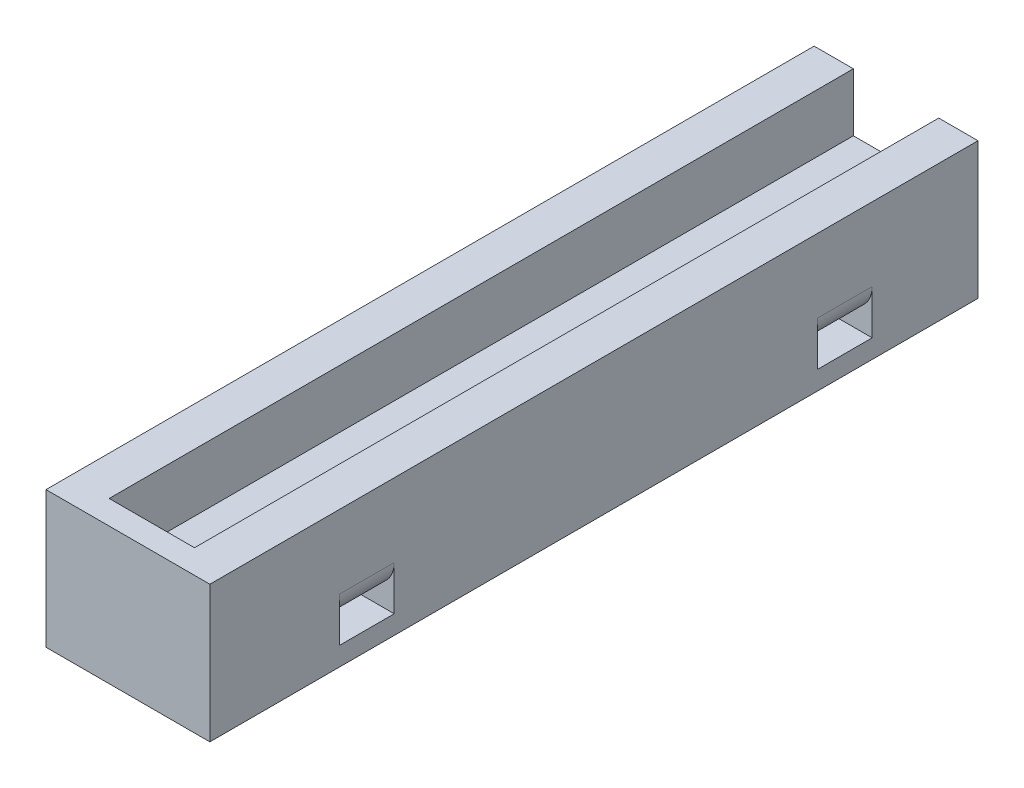
ISO-10303-21;
HEADER;
FILE_DESCRIPTION(('STEP AP214'),'2;1');
FILE_NAME('part.step','',(''),(''),'','','');
FILE_SCHEMA(('AUTOMOTIVE_DESIGN { 1 0 10303 214 1 1 1 1 }'));
ENDSEC;
DATA;
#1=APPLICATION_CONTEXT('core data for automotive mechanical design processes');
#2=APPLICATION_PROTOCOL_DEFINITION('international standard','automotive_design',2000,#1);
#3=PRODUCT_CONTEXT('',#1,'mechanical');
#4=PRODUCT('Part','Part','',(#3));
#5=PRODUCT_RELATED_PRODUCT_CATEGORY('part','',(#4));
#6=PRODUCT_DEFINITION_FORMATION('','',#4);
#7=PRODUCT_DEFINITION_CONTEXT('part definition',#1,'design');
#8=PRODUCT_DEFINITION('design','',#6,#7);
#9=PRODUCT_DEFINITION_SHAPE('','',#8);
#10=(LENGTH_UNIT() NAMED_UNIT(*) SI_UNIT(.MILLI.,.METRE.));
#11=(NAMED_UNIT(*) PLANE_ANGLE_UNIT() SI_UNIT($,.RADIAN.));
#12=(NAMED_UNIT(*) SI_UNIT($,.STERADIAN.) SOLID_ANGLE_UNIT());
#13=UNCERTAINTY_MEASURE_WITH_UNIT(LENGTH_MEASURE(1.E-05),#10,'distance_accuracy_value','');
#14=(GEOMETRIC_REPRESENTATION_CONTEXT(3) GLOBAL_UNCERTAINTY_ASSIGNED_CONTEXT((#13)) GLOBAL_UNIT_ASSIGNED_CONTEXT((#10,
#11,#12)) REPRESENTATION_CONTEXT('',''));
#15=CARTESIAN_POINT('',(0.,0.,0.));
#16=DIRECTION('',(0.,0.,1.));
#17=DIRECTION('',(1.,0.,0.));
#18=AXIS2_PLACEMENT_3D('',#15,#16,#17);
#19=CARTESIAN_POINT('',(-43.,0.,109.));
#20=DIRECTION('',(-1.,0.,0.));
#21=DIRECTION('',(0.,0.,1.));
#22=AXIS2_PLACEMENT_3D('',#19,#20,#21);
#23=PLANE('',#22);
#24=DIRECTION('',(0.,0.,1.));
#25=VECTOR('',#24,1.);
#26=CARTESIAN_POINT('',(-43.,9.25,93.5));
#27=LINE('',#26,#25);
#28=CARTESIAN_POINT('',(-43.,9.25,85.5));
#29=VERTEX_POINT('',#28);
#30=CARTESIAN_POINT('',(-43.,9.25,93.5));
#31=VERTEX_POINT('',#30);
#32=EDGE_CURVE('E206',#29,#31,#27,.T.);
#33=ORIENTED_EDGE('',*,*,#32,.T.);
#34=DIRECTION('',(0.,-1.,0.));
#35=VECTOR('',#34,1.);
#36=CARTESIAN_POINT('',(-43.,2.75,93.5));
#37=LINE('',#36,#35);
#38=CARTESIAN_POINT('',(-43.,2.75,93.5));
#39=VERTEX_POINT('',#38);
#40=EDGE_CURVE('E186',#31,#39,#37,.T.);
#41=ORIENTED_EDGE('',*,*,#40,.T.);
#42=DIRECTION('',(0.,0.,-1.));
#43=VECTOR('',#42,1.);
#44=CARTESIAN_POINT('',(-43.,2.75,93.5));
#45=LINE('',#44,#43);
#46=CARTESIAN_POINT('',(-43.,2.75,85.5));
#47=VERTEX_POINT('',#46);
#48=EDGE_CURVE('E197',#39,#47,#45,.T.);
#49=ORIENTED_EDGE('',*,*,#48,.T.);
#50=DIRECTION('',(0.,1.,0.));
#51=VECTOR('',#50,1.);
#52=CARTESIAN_POINT('',(-43.,2.75,85.5));
#53=LINE('',#52,#51);
#54=EDGE_CURVE('E207',#47,#29,#53,.T.);
#55=ORIENTED_EDGE('',*,*,#54,.T.);
#56=EDGE_LOOP('',(#33,#41,#49,#55));
#57=FACE_BOUND('',#56,.T.);
#58=DIRECTION('',(0.,0.,1.));
#59=VECTOR('',#58,1.);
#60=CARTESIAN_POINT('',(-43.,9.25,23.5));
#61=LINE('',#60,#59);
#62=CARTESIAN_POINT('',(-43.,9.25,15.5));
#63=VERTEX_POINT('',#62);
#64=CARTESIAN_POINT('',(-43.,9.25,23.5));
#65=VERTEX_POINT('',#64);
#66=EDGE_CURVE('E322',#63,#65,#61,.T.);
#67=ORIENTED_EDGE('',*,*,#66,.T.);
#68=DIRECTION('',(0.,-1.,0.));
#69=VECTOR('',#68,1.);
#70=CARTESIAN_POINT('',(-43.,2.75,23.5));
#71=LINE('',#70,#69);
#72=CARTESIAN_POINT('',(-43.,2.75,23.5));
#73=VERTEX_POINT('',#72);
#74=EDGE_CURVE('E236',#65,#73,#71,.T.);
#75=ORIENTED_EDGE('',*,*,#74,.T.);
#76=DIRECTION('',(0.,0.,-1.));
#77=VECTOR('',#76,1.);
#78=CARTESIAN_POINT('',(-43.,2.75,15.5));
#79=LINE('',#78,#77);
#80=CARTESIAN_POINT('',(-43.,2.75,15.5));
#81=VERTEX_POINT('',#80);
#82=EDGE_CURVE('E241',#73,#81,#79,.T.);
#83=ORIENTED_EDGE('',*,*,#82,.T.);
#84=DIRECTION('',(0.,1.,0.));
#85=VECTOR('',#84,1.);
#86=CARTESIAN_POINT('',(-43.,2.75,15.5));
#87=LINE('',#86,#85);
#88=EDGE_CURVE('E225',#81,#63,#87,.T.);
#89=ORIENTED_EDGE('',*,*,#88,.T.);
#90=EDGE_LOOP('',(#67,#75,#83,#89));
#91=FACE_BOUND('',#90,.T.);
#92=DIRECTION('',(0.,1.,0.));
#93=VECTOR('',#92,1.);
#94=CARTESIAN_POINT('',(-43.,0.,0.));
#95=LINE('',#94,#93);
#96=CARTESIAN_POINT('',(-43.,0.,0.));
#97=VERTEX_POINT('',#96);
#98=CARTESIAN_POINT('',(-43.,20.,0.));
#99=VERTEX_POINT('',#98);
#100=EDGE_CURVE('E270',#97,#99,#95,.T.);
#101=ORIENTED_EDGE('',*,*,#100,.F.);
#102=DIRECTION('',(0.,0.,-1.));
#103=VECTOR('',#102,1.);
#104=CARTESIAN_POINT('',(-43.,0.,109.));
#105=LINE('',#104,#103);
#106=CARTESIAN_POINT('',(-43.,0.,112.5));
#107=VERTEX_POINT('',#106);
#108=EDGE_CURVE('E319',#107,#97,#105,.T.);
#109=ORIENTED_EDGE('',*,*,#108,.F.);
#110=DIRECTION('',(0.,-1.,0.));
#111=VECTOR('',#110,1.);
#112=CARTESIAN_POINT('',(-43.,20.,112.5));
#113=LINE('',#112,#111);
#114=CARTESIAN_POINT('',(-43.,20.,112.5));
#115=VERTEX_POINT('',#114);
#116=EDGE_CURVE('E258',#115,#107,#113,.T.);
#117=ORIENTED_EDGE('',*,*,#116,.F.);
#118=DIRECTION('',(0.,0.,-1.));
#119=VECTOR('',#118,1.);
#120=CARTESIAN_POINT('',(-43.,20.,109.));
#121=LINE('',#120,#119);
#122=EDGE_CURVE('E283',#115,#99,#121,.T.);
#123=ORIENTED_EDGE('',*,*,#122,.T.);
#124=EDGE_LOOP('',(#101,#109,#117,#123));
#125=FACE_BOUND('',#124,.T.);
#126=ADVANCED_FACE('F41',(#57,#91,#125),#23,.T.);
#127=CARTESIAN_POINT('',(0.,0.,109.));
#128=DIRECTION('',(0.,-1.,0.));
#129=DIRECTION('',(1.,0.,0.));
#130=AXIS2_PLACEMENT_3D('',#127,#128,#129);
#131=PLANE('',#130);
#132=DIRECTION('',(-1.,0.,0.));
#133=VECTOR('',#132,1.);
#134=CARTESIAN_POINT('',(0.,0.,0.));
#135=LINE('',#134,#133);
#136=CARTESIAN_POINT('',(-19.,0.,0.));
#137=VERTEX_POINT('',#136);
#138=EDGE_CURVE('E286',#137,#97,#135,.T.);
#139=ORIENTED_EDGE('',*,*,#138,.F.);
#140=DIRECTION('',(0.,0.,-1.));
#141=VECTOR('',#140,1.);
#142=CARTESIAN_POINT('',(-19.,0.,109.));
#143=LINE('',#142,#141);
#144=CARTESIAN_POINT('',(-19.,0.,112.5));
#145=VERTEX_POINT('',#144);
#146=EDGE_CURVE('E317',#145,#137,#143,.T.);
#147=ORIENTED_EDGE('',*,*,#146,.F.);
#148=DIRECTION('',(1.,0.,0.));
#149=VECTOR('',#148,1.);
#150=CARTESIAN_POINT('',(-43.,0.,112.5));
#151=LINE('',#150,#149);
#152=EDGE_CURVE('E261',#107,#145,#151,.T.);
#153=ORIENTED_EDGE('',*,*,#152,.F.);
#154=ORIENTED_EDGE('',*,*,#108,.T.);
#155=EDGE_LOOP('',(#139,#147,#153,#154));
#156=FACE_BOUND('',#155,.T.);
#157=ADVANCED_FACE('F382',(#156),#131,.T.);
#158=CARTESIAN_POINT('',(-19.,0.,109.));
#159=DIRECTION('',(-1.,0.,0.));
#160=DIRECTION('',(0.,0.,1.));
#161=AXIS2_PLACEMENT_3D('',#158,#159,#160);
#162=PLANE('',#161);
#163=DIRECTION('',(0.,-1.,0.));
#164=VECTOR('',#163,1.);
#165=CARTESIAN_POINT('',(-19.,2.75,93.5));
#166=LINE('',#165,#164);
#167=CARTESIAN_POINT('',(-19.,9.25,93.5));
#168=VERTEX_POINT('',#167);
#169=CARTESIAN_POINT('',(-19.,2.75,93.5));
#170=VERTEX_POINT('',#169);
#171=EDGE_CURVE('E189',#168,#170,#166,.T.);
#172=ORIENTED_EDGE('',*,*,#171,.F.);
#173=DIRECTION('',(0.,0.,1.));
#174=VECTOR('',#173,1.);
#175=CARTESIAN_POINT('',(-19.,9.25,109.));
#176=LINE('',#175,#174);
#177=CARTESIAN_POINT('',(-19.,9.25,85.5));
#178=VERTEX_POINT('',#177);
#179=EDGE_CURVE('E335',#168,#178,#176,.F.);
#180=ORIENTED_EDGE('',*,*,#179,.T.);
#181=DIRECTION('',(0.,1.,0.));
#182=VECTOR('',#181,1.);
#183=CARTESIAN_POINT('',(-19.,2.75,85.5));
#184=LINE('',#183,#182);
#185=CARTESIAN_POINT('',(-19.,2.75,85.5));
#186=VERTEX_POINT('',#185);
#187=EDGE_CURVE('E212',#186,#178,#184,.T.);
#188=ORIENTED_EDGE('',*,*,#187,.F.);
#189=DIRECTION('',(0.,0.,-1.));
#190=VECTOR('',#189,1.);
#191=CARTESIAN_POINT('',(-19.,2.75,93.5));
#192=LINE('',#191,#190);
#193=EDGE_CURVE('E209',#170,#186,#192,.T.);
#194=ORIENTED_EDGE('',*,*,#193,.F.);
#195=EDGE_LOOP('',(#172,#180,#188,#194));
#196=FACE_BOUND('',#195,.T.);
#197=DIRECTION('',(0.,-1.,0.));
#198=VECTOR('',#197,1.);
#199=CARTESIAN_POINT('',(-19.,2.75,23.5));
#200=LINE('',#199,#198);
#201=CARTESIAN_POINT('',(-19.,9.25,23.5));
#202=VERTEX_POINT('',#201);
#203=CARTESIAN_POINT('',(-19.,2.75,23.5));
#204=VERTEX_POINT('',#203);
#205=EDGE_CURVE('E56',#202,#204,#200,.T.);
#206=ORIENTED_EDGE('',*,*,#205,.F.);
#207=DIRECTION('',(0.,0.,1.));
#208=VECTOR('',#207,1.);
#209=CARTESIAN_POINT('',(-19.,9.24999999999999,109.));
#210=LINE('',#209,#208);
#211=CARTESIAN_POINT('',(-19.,9.25,15.5));
#212=VERTEX_POINT('',#211);
#213=EDGE_CURVE('E338',#202,#212,#210,.F.);
#214=ORIENTED_EDGE('',*,*,#213,.T.);
#215=DIRECTION('',(0.,1.,0.));
#216=VECTOR('',#215,1.);
#217=CARTESIAN_POINT('',(-19.,2.75,15.5));
#218=LINE('',#217,#216);
#219=CARTESIAN_POINT('',(-19.,2.75,15.5));
#220=VERTEX_POINT('',#219);
#221=EDGE_CURVE('E64',#220,#212,#218,.T.);
#222=ORIENTED_EDGE('',*,*,#221,.F.);
#223=DIRECTION('',(0.,0.,-1.));
#224=VECTOR('',#223,1.);
#225=CARTESIAN_POINT('',(-19.,2.75,15.5));
#226=LINE('',#225,#224);
#227=EDGE_CURVE('E235',#204,#220,#226,.T.);
#228=ORIENTED_EDGE('',*,*,#227,.F.);
#229=EDGE_LOOP('',(#206,#214,#222,#228));
#230=FACE_BOUND('',#229,.T.);
#231=DIRECTION('',(0.,1.,0.));
#232=VECTOR('',#231,1.);
#233=CARTESIAN_POINT('',(-19.,0.,0.));
#234=LINE('',#233,#232);
#235=CARTESIAN_POINT('',(-19.,20.,0.));
#236=VERTEX_POINT('',#235);
#237=EDGE_CURVE('E289',#137,#236,#234,.T.);
#238=ORIENTED_EDGE('',*,*,#237,.T.);
#239=DIRECTION('',(0.,0.,-1.));
#240=VECTOR('',#239,1.);
#241=CARTESIAN_POINT('',(-19.,20.,109.));
#242=LINE('',#241,#240);
#243=CARTESIAN_POINT('',(-19.,20.,112.5));
#244=VERTEX_POINT('',#243);
#245=EDGE_CURVE('E315',#244,#236,#242,.T.);
#246=ORIENTED_EDGE('',*,*,#245,.F.);
#247=DIRECTION('',(0.,1.,0.));
#248=VECTOR('',#247,1.);
#249=CARTESIAN_POINT('',(-19.,20.,112.5));
#250=LINE('',#249,#248);
#251=EDGE_CURVE('E264',#145,#244,#250,.T.);
#252=ORIENTED_EDGE('',*,*,#251,.F.);
#253=ORIENTED_EDGE('',*,*,#146,.T.);
#254=EDGE_LOOP('',(#238,#246,#252,#253));
#255=FACE_BOUND('',#254,.T.);
#256=ADVANCED_FACE('F360',(#196,#230,#255),#162,.F.);
#257=CARTESIAN_POINT('',(-24.75,0.,109.));
#258=DIRECTION('',(-1.,0.,0.));
#259=DIRECTION('',(0.,0.,1.));
#260=AXIS2_PLACEMENT_3D('',#257,#258,#259);
#261=PLANE('',#260);
#262=DIRECTION('',(0.,1.,0.));
#263=VECTOR('',#262,1.);
#264=CARTESIAN_POINT('',(-24.75,0.,0.));
#265=LINE('',#264,#263);
#266=CARTESIAN_POINT('',(-24.75,11.5,0.));
#267=VERTEX_POINT('',#266);
#268=CARTESIAN_POINT('',(-24.75,20.,0.));
#269=VERTEX_POINT('',#268);
#270=EDGE_CURVE('E295',#267,#269,#265,.T.);
#271=ORIENTED_EDGE('',*,*,#270,.F.);
#272=DIRECTION('',(0.,0.,-1.));
#273=VECTOR('',#272,1.);
#274=CARTESIAN_POINT('',(-24.75,11.5,109.));
#275=LINE('',#274,#273);
#276=CARTESIAN_POINT('',(-24.75,11.5,109.));
#277=VERTEX_POINT('',#276);
#278=EDGE_CURVE('E311',#277,#267,#275,.T.);
#279=ORIENTED_EDGE('',*,*,#278,.F.);
#280=DIRECTION('',(0.,1.,0.));
#281=VECTOR('',#280,1.);
#282=CARTESIAN_POINT('',(-24.75,0.,109.));
#283=LINE('',#282,#281);
#284=CARTESIAN_POINT('',(-24.75,20.,109.));
#285=VERTEX_POINT('',#284);
#286=EDGE_CURVE('E273',#277,#285,#283,.T.);
#287=ORIENTED_EDGE('',*,*,#286,.T.);
#288=DIRECTION('',(0.,0.,-1.));
#289=VECTOR('',#288,1.);
#290=CARTESIAN_POINT('',(-24.75,20.,109.));
#291=LINE('',#290,#289);
#292=EDGE_CURVE('E313',#285,#269,#291,.T.);
#293=ORIENTED_EDGE('',*,*,#292,.T.);
#294=EDGE_LOOP('',(#271,#279,#287,#293));
#295=FACE_BOUND('',#294,.T.);
#296=ADVANCED_FACE('F420',(#295),#261,.T.);
#297=CARTESIAN_POINT('',(0.,11.5,109.));
#298=DIRECTION('',(0.,1.,0.));
#299=DIRECTION('',(0.,0.,1.));
#300=AXIS2_PLACEMENT_3D('',#297,#298,#299);
#301=PLANE('',#300);
#302=DIRECTION('',(1.,0.,0.));
#303=VECTOR('',#302,1.);
#304=CARTESIAN_POINT('',(0.,11.5,0.));
#305=LINE('',#304,#303);
#306=CARTESIAN_POINT('',(-37.25,11.5,0.));
#307=VERTEX_POINT('',#306);
#308=EDGE_CURVE('E298',#307,#267,#305,.T.);
#309=ORIENTED_EDGE('',*,*,#308,.F.);
#310=DIRECTION('',(0.,0.,-1.));
#311=VECTOR('',#310,1.);
#312=CARTESIAN_POINT('',(-37.25,11.5,109.));
#313=LINE('',#312,#311);
#314=CARTESIAN_POINT('',(-37.25,11.5,109.));
#315=VERTEX_POINT('',#314);
#316=EDGE_CURVE('E309',#315,#307,#313,.T.);
#317=ORIENTED_EDGE('',*,*,#316,.F.);
#318=DIRECTION('',(1.,0.,0.));
#319=VECTOR('',#318,1.);
#320=CARTESIAN_POINT('',(0.,11.5,109.));
#321=LINE('',#320,#319);
#322=EDGE_CURVE('E276',#315,#277,#321,.T.);
#323=ORIENTED_EDGE('',*,*,#322,.T.);
#324=ORIENTED_EDGE('',*,*,#278,.T.);
#325=EDGE_LOOP('',(#309,#317,#323,#324));
#326=FACE_BOUND('',#325,.T.);
#327=ADVANCED_FACE('F445',(#326),#301,.T.);
#328=CARTESIAN_POINT('',(-37.25,0.,109.));
#329=DIRECTION('',(1.,0.,0.));
#330=DIRECTION('',(0.,0.,-1.));
#331=AXIS2_PLACEMENT_3D('',#328,#329,#330);
#332=PLANE('',#331);
#333=DIRECTION('',(0.,-1.,0.));
#334=VECTOR('',#333,1.);
#335=CARTESIAN_POINT('',(-37.25,0.,0.));
#336=LINE('',#335,#334);
#337=CARTESIAN_POINT('',(-37.25,20.,0.));
#338=VERTEX_POINT('',#337);
#339=EDGE_CURVE('E301',#338,#307,#336,.T.);
#340=ORIENTED_EDGE('',*,*,#339,.F.);
#341=DIRECTION('',(0.,0.,-1.));
#342=VECTOR('',#341,1.);
#343=CARTESIAN_POINT('',(-37.25,20.,109.));
#344=LINE('',#343,#342);
#345=CARTESIAN_POINT('',(-37.25,20.,109.));
#346=VERTEX_POINT('',#345);
#347=EDGE_CURVE('E307',#346,#338,#344,.T.);
#348=ORIENTED_EDGE('',*,*,#347,.F.);
#349=DIRECTION('',(0.,-1.,0.));
#350=VECTOR('',#349,1.);
#351=CARTESIAN_POINT('',(-37.25,0.,109.));
#352=LINE('',#351,#350);
#353=EDGE_CURVE('E280',#346,#315,#352,.T.);
#354=ORIENTED_EDGE('',*,*,#353,.T.);
#355=ORIENTED_EDGE('',*,*,#316,.T.);
#356=EDGE_LOOP('',(#340,#348,#354,#355));
#357=FACE_BOUND('',#356,.T.);
#358=ADVANCED_FACE('F441',(#357),#332,.T.);
#359=CARTESIAN_POINT('',(0.,20.,109.));
#360=DIRECTION('',(0.,-1.,0.));
#361=DIRECTION('',(1.,0.,0.));
#362=AXIS2_PLACEMENT_3D('',#359,#360,#361);
#363=PLANE('',#362);
#364=DIRECTION('',(-1.,0.,0.));
#365=VECTOR('',#364,1.);
#366=CARTESIAN_POINT('',(0.,20.,0.));
#367=LINE('',#366,#365);
#368=EDGE_CURVE('E277',#338,#99,#367,.T.);
#369=ORIENTED_EDGE('',*,*,#368,.T.);
#370=ORIENTED_EDGE('',*,*,#122,.F.);
#371=DIRECTION('',(-1.,0.,0.));
#372=VECTOR('',#371,1.);
#373=CARTESIAN_POINT('',(-43.,20.,112.5));
#374=LINE('',#373,#372);
#375=EDGE_CURVE('E267',#244,#115,#374,.T.);
#376=ORIENTED_EDGE('',*,*,#375,.F.);
#377=ORIENTED_EDGE('',*,*,#245,.T.);
#378=DIRECTION('',(1.,0.,0.));
#379=VECTOR('',#378,1.);
#380=CARTESIAN_POINT('',(0.,20.,0.));
#381=LINE('',#380,#379);
#382=EDGE_CURVE('E292',#269,#236,#381,.T.);
#383=ORIENTED_EDGE('',*,*,#382,.F.);
#384=ORIENTED_EDGE('',*,*,#292,.F.);
#385=DIRECTION('',(-1.,0.,0.));
#386=VECTOR('',#385,1.);
#387=CARTESIAN_POINT('',(-43.,20.,109.));
#388=LINE('',#387,#386);
#389=EDGE_CURVE('E257',#285,#346,#388,.T.);
#390=ORIENTED_EDGE('',*,*,#389,.T.);
#391=ORIENTED_EDGE('',*,*,#347,.T.);
#392=EDGE_LOOP('',(#369,#370,#376,#377,#383,#384,#390,#391));
#393=FACE_BOUND('',#392,.T.);
#394=ADVANCED_FACE('F430',(#393),#363,.F.);
#395=CARTESIAN_POINT('',(0.,0.,0.));
#396=DIRECTION('',(0.,0.,1.));
#397=DIRECTION('',(1.,0.,0.));
#398=AXIS2_PLACEMENT_3D('',#395,#396,#397);
#399=PLANE('',#398);
#400=CARTESIAN_POINT('',(-26.,5.6,0.));
#401=DIRECTION('',(0.,0.,-1.));
#402=DIRECTION('',(-1.,0.,0.));
#403=AXIS2_PLACEMENT_3D('',#400,#401,#402);
#404=CIRCLE('',#403,1.59999999999999);
#405=CARTESIAN_POINT('',(-27.6,5.6,0.));
#406=VERTEX_POINT('',#405);
#407=EDGE_CURVE('E216',#406,#406,#404,.T.);
#408=ORIENTED_EDGE('',*,*,#407,.F.);
#409=EDGE_LOOP('',(#408));
#410=FACE_BOUND('',#409,.T.);
#411=CARTESIAN_POINT('',(-36.,5.6,0.));
#412=DIRECTION('',(0.,0.,-1.));
#413=DIRECTION('',(-1.,0.,0.));
#414=AXIS2_PLACEMENT_3D('',#411,#412,#413);
#415=CIRCLE('',#414,1.59999999999999);
#416=CARTESIAN_POINT('',(-37.6,5.6,0.));
#417=VERTEX_POINT('',#416);
#418=EDGE_CURVE('E251',#417,#417,#415,.T.);
#419=ORIENTED_EDGE('',*,*,#418,.F.);
#420=EDGE_LOOP('',(#419));
#421=FACE_BOUND('',#420,.T.);
#422=ORIENTED_EDGE('',*,*,#100,.T.);
#423=ORIENTED_EDGE('',*,*,#368,.F.);
#424=ORIENTED_EDGE('',*,*,#339,.T.);
#425=ORIENTED_EDGE('',*,*,#308,.T.);
#426=ORIENTED_EDGE('',*,*,#270,.T.);
#427=ORIENTED_EDGE('',*,*,#382,.T.);
#428=ORIENTED_EDGE('',*,*,#237,.F.);
#429=ORIENTED_EDGE('',*,*,#138,.T.);
#430=EDGE_LOOP('',(#422,#423,#424,#425,#426,#427,#428,#429));
#431=FACE_BOUND('',#430,.T.);
#432=ADVANCED_FACE('F426',(#410,#421,#431),#399,.F.);
#433=CARTESIAN_POINT('',(0.,0.,112.5));
#434=DIRECTION('',(0.,0.,1.));
#435=DIRECTION('',(1.,0.,0.));
#436=AXIS2_PLACEMENT_3D('',#433,#434,#435);
#437=PLANE('',#436);
#438=ORIENTED_EDGE('',*,*,#116,.T.);
#439=ORIENTED_EDGE('',*,*,#152,.T.);
#440=ORIENTED_EDGE('',*,*,#251,.T.);
#441=ORIENTED_EDGE('',*,*,#375,.T.);
#442=EDGE_LOOP('',(#438,#439,#440,#441));
#443=FACE_BOUND('',#442,.T.);
#444=ADVANCED_FACE('F434',(#443),#437,.T.);
#445=CARTESIAN_POINT('',(0.,0.,109.));
#446=DIRECTION('',(0.,0.,1.));
#447=DIRECTION('',(1.,0.,0.));
#448=AXIS2_PLACEMENT_3D('',#445,#446,#447);
#449=PLANE('',#448);
#450=ORIENTED_EDGE('',*,*,#286,.F.);
#451=ORIENTED_EDGE('',*,*,#322,.F.);
#452=ORIENTED_EDGE('',*,*,#353,.F.);
#453=ORIENTED_EDGE('',*,*,#389,.F.);
#454=EDGE_LOOP('',(#450,#451,#452,#453));
#455=FACE_BOUND('',#454,.T.);
#456=ADVANCED_FACE('F449',(#455),#449,.F.);
#457=CARTESIAN_POINT('',(-36.,5.6,6.50000000000001));
#458=DIRECTION('',(0.,0.,-1.));
#459=DIRECTION('',(-1.,0.,0.));
#460=AXIS2_PLACEMENT_3D('',#457,#458,#459);
#461=CONICAL_SURFACE('',#460,1.59999999999999,1.02974425867666);
#462=CARTESIAN_POINT('',(-36.,5.6,7.46137699044409));
#463=VERTEX_POINT('',#462);
#464=VERTEX_LOOP('',#463);
#465=FACE_BOUND('',#464,.T.);
#466=CARTESIAN_POINT('',(-36.,5.6,6.50000000000001));
#467=DIRECTION('',(0.,0.,-1.));
#468=DIRECTION('',(-1.,0.,0.));
#469=AXIS2_PLACEMENT_3D('',#466,#467,#468);
#470=CIRCLE('',#469,1.59999999999999);
#471=CARTESIAN_POINT('',(-37.6,5.6,6.50000000000001));
#472=VERTEX_POINT('',#471);
#473=EDGE_CURVE('E254',#472,#472,#470,.T.);
#474=ORIENTED_EDGE('',*,*,#473,.T.);
#475=EDGE_LOOP('',(#474));
#476=FACE_BOUND('',#475,.T.);
#477=ADVANCED_FACE('F451',(#465,#476),#461,.F.);
#478=CARTESIAN_POINT('',(-36.,5.6,0.));
#479=DIRECTION('',(0.,0.,-1.));
#480=DIRECTION('',(-1.,0.,0.));
#481=AXIS2_PLACEMENT_3D('',#478,#479,#480);
#482=CYLINDRICAL_SURFACE('',#481,1.59999999999999);
#483=ORIENTED_EDGE('',*,*,#473,.F.);
#484=EDGE_LOOP('',(#483));
#485=FACE_BOUND('',#484,.T.);
#486=ORIENTED_EDGE('',*,*,#418,.T.);
#487=EDGE_LOOP('',(#486));
#488=FACE_BOUND('',#487,.T.);
#489=ADVANCED_FACE('F458',(#485,#488),#482,.F.);
#490=CARTESIAN_POINT('',(-26.,5.6,6.50000000000001));
#491=DIRECTION('',(0.,0.,-1.));
#492=DIRECTION('',(-1.,0.,0.));
#493=AXIS2_PLACEMENT_3D('',#490,#491,#492);
#494=CONICAL_SURFACE('',#493,1.59999999999999,1.02974425867665);
#495=CARTESIAN_POINT('',(-26.,5.6,7.46137699044409));
#496=VERTEX_POINT('',#495);
#497=VERTEX_LOOP('',#496);
#498=FACE_BOUND('',#497,.T.);
#499=CARTESIAN_POINT('',(-26.,5.6,6.50000000000001));
#500=DIRECTION('',(0.,0.,-1.));
#501=DIRECTION('',(-1.,0.,0.));
#502=AXIS2_PLACEMENT_3D('',#499,#500,#501);
#503=CIRCLE('',#502,1.59999999999999);
#504=CARTESIAN_POINT('',(-27.6,5.6,6.50000000000001));
#505=VERTEX_POINT('',#504);
#506=EDGE_CURVE('E248',#505,#505,#503,.T.);
#507=ORIENTED_EDGE('',*,*,#506,.T.);
#508=EDGE_LOOP('',(#507));
#509=FACE_BOUND('',#508,.T.);
#510=ADVANCED_FACE('F519',(#498,#509),#494,.F.);
#511=CARTESIAN_POINT('',(-26.,5.6,0.));
#512=DIRECTION('',(0.,0.,-1.));
#513=DIRECTION('',(-1.,0.,0.));
#514=AXIS2_PLACEMENT_3D('',#511,#512,#513);
#515=CYLINDRICAL_SURFACE('',#514,1.59999999999999);
#516=ORIENTED_EDGE('',*,*,#506,.F.);
#517=EDGE_LOOP('',(#516));
#518=FACE_BOUND('',#517,.T.);
#519=ORIENTED_EDGE('',*,*,#407,.T.);
#520=EDGE_LOOP('',(#519));
#521=FACE_BOUND('',#520,.T.);
#522=ADVANCED_FACE('F529',(#518,#521),#515,.F.);
#523=CARTESIAN_POINT('',(-43.,2.75,23.5));
#524=DIRECTION('',(0.,0.,1.));
#525=DIRECTION('',(0.,-1.,0.));
#526=AXIS2_PLACEMENT_3D('',#523,#524,#525);
#527=PLANE('',#526);
#528=ORIENTED_EDGE('',*,*,#205,.T.);
#529=DIRECTION('',(1.,0.,0.));
#530=VECTOR('',#529,1.);
#531=CARTESIAN_POINT('',(-43.,2.75,23.5));
#532=LINE('',#531,#530);
#533=EDGE_CURVE('E222',#73,#204,#532,.T.);
#534=ORIENTED_EDGE('',*,*,#533,.F.);
#535=ORIENTED_EDGE('',*,*,#74,.F.);
#536=CARTESIAN_POINT('',(-39.,9.25,23.5));
#537=DIRECTION('',(0.,0.,1.));
#538=DIRECTION('',(0.,-1.,0.));
#539=AXIS2_PLACEMENT_3D('',#536,#537,#538);
#540=CIRCLE('',#539,4.);
#541=CARTESIAN_POINT('',(-39.,5.25,23.5));
#542=VERTEX_POINT('',#541);
#543=EDGE_CURVE('E340',#65,#542,#540,.T.);
#544=ORIENTED_EDGE('',*,*,#543,.T.);
#545=DIRECTION('',(1.,0.,0.));
#546=VECTOR('',#545,1.);
#547=CARTESIAN_POINT('',(-43.,5.25,23.5));
#548=LINE('',#547,#546);
#549=CARTESIAN_POINT('',(-23.,5.25,23.5));
#550=VERTEX_POINT('',#549);
#551=EDGE_CURVE('E231',#542,#550,#548,.T.);
#552=ORIENTED_EDGE('',*,*,#551,.T.);
#553=CARTESIAN_POINT('',(-23.,9.25,23.5));
#554=DIRECTION('',(0.,0.,1.));
#555=DIRECTION('',(0.,-1.,0.));
#556=AXIS2_PLACEMENT_3D('',#553,#554,#555);
#557=CIRCLE('',#556,4.);
#558=EDGE_CURVE('E350',#550,#202,#557,.T.);
#559=ORIENTED_EDGE('',*,*,#558,.T.);
#560=EDGE_LOOP('',(#528,#534,#535,#544,#552,#559));
#561=FACE_BOUND('',#560,.T.);
#562=ADVANCED_FACE('F418',(#561),#527,.F.);
#563=CARTESIAN_POINT('',(-43.,5.25,15.5));
#564=DIRECTION('',(0.,1.,0.));
#565=DIRECTION('',(0.,0.,1.));
#566=AXIS2_PLACEMENT_3D('',#563,#564,#565);
#567=PLANE('',#566);
#568=ORIENTED_EDGE('',*,*,#551,.F.);
#569=DIRECTION('',(0.,0.,1.));
#570=VECTOR('',#569,1.);
#571=CARTESIAN_POINT('',(-39.,5.25,15.5));
#572=LINE('',#571,#570);
#573=CARTESIAN_POINT('',(-39.,5.25,15.5));
#574=VERTEX_POINT('',#573);
#575=EDGE_CURVE('E328',#542,#574,#572,.F.);
#576=ORIENTED_EDGE('',*,*,#575,.T.);
#577=DIRECTION('',(1.,0.,0.));
#578=VECTOR('',#577,1.);
#579=CARTESIAN_POINT('',(-43.,5.25,15.5));
#580=LINE('',#579,#578);
#581=CARTESIAN_POINT('',(-23.,5.25,15.5));
#582=VERTEX_POINT('',#581);
#583=EDGE_CURVE('E228',#574,#582,#580,.T.);
#584=ORIENTED_EDGE('',*,*,#583,.T.);
#585=DIRECTION('',(0.,0.,1.));
#586=VECTOR('',#585,1.);
#587=CARTESIAN_POINT('',(-23.,5.25,15.5));
#588=LINE('',#587,#586);
#589=EDGE_CURVE('E325',#582,#550,#588,.T.);
#590=ORIENTED_EDGE('',*,*,#589,.T.);
#591=EDGE_LOOP('',(#568,#576,#584,#590));
#592=FACE_BOUND('',#591,.T.);
#593=ADVANCED_FACE('F408',(#592),#567,.F.);
#594=CARTESIAN_POINT('',(-43.,2.75,15.5));
#595=DIRECTION('',(0.,0.,-1.));
#596=DIRECTION('',(-1.,0.,0.));
#597=AXIS2_PLACEMENT_3D('',#594,#595,#596);
#598=PLANE('',#597);
#599=ORIENTED_EDGE('',*,*,#221,.T.);
#600=CARTESIAN_POINT('',(-23.,9.25,15.5));
#601=DIRECTION('',(0.,0.,-1.));
#602=DIRECTION('',(-1.,0.,0.));
#603=AXIS2_PLACEMENT_3D('',#600,#601,#602);
#604=CIRCLE('',#603,4.);
#605=EDGE_CURVE('E352',#212,#582,#604,.T.);
#606=ORIENTED_EDGE('',*,*,#605,.T.);
#607=ORIENTED_EDGE('',*,*,#583,.F.);
#608=CARTESIAN_POINT('',(-39.,9.25,15.5));
#609=DIRECTION('',(0.,0.,-1.));
#610=DIRECTION('',(-1.,0.,0.));
#611=AXIS2_PLACEMENT_3D('',#608,#609,#610);
#612=CIRCLE('',#611,4.);
#613=EDGE_CURVE('E342',#574,#63,#612,.T.);
#614=ORIENTED_EDGE('',*,*,#613,.T.);
#615=ORIENTED_EDGE('',*,*,#88,.F.);
#616=DIRECTION('',(1.,0.,0.));
#617=VECTOR('',#616,1.);
#618=CARTESIAN_POINT('',(-43.,2.75,15.5));
#619=LINE('',#618,#617);
#620=EDGE_CURVE('E226',#81,#220,#619,.T.);
#621=ORIENTED_EDGE('',*,*,#620,.T.);
#622=EDGE_LOOP('',(#599,#606,#607,#614,#615,#621));
#623=FACE_BOUND('',#622,.T.);
#624=ADVANCED_FACE('F404',(#623),#598,.F.);
#625=CARTESIAN_POINT('',(-43.,2.75,15.5));
#626=DIRECTION('',(0.,-1.,0.));
#627=DIRECTION('',(0.,0.,-1.));
#628=AXIS2_PLACEMENT_3D('',#625,#626,#627);
#629=PLANE('',#628);
#630=ORIENTED_EDGE('',*,*,#227,.T.);
#631=ORIENTED_EDGE('',*,*,#620,.F.);
#632=ORIENTED_EDGE('',*,*,#82,.F.);
#633=ORIENTED_EDGE('',*,*,#533,.T.);
#634=EDGE_LOOP('',(#630,#631,#632,#633));
#635=FACE_BOUND('',#634,.T.);
#636=ADVANCED_FACE('F415',(#635),#629,.F.);
#637=CARTESIAN_POINT('',(-43.,2.75,85.5));
#638=DIRECTION('',(0.,0.,-1.));
#639=DIRECTION('',(-1.,0.,0.));
#640=AXIS2_PLACEMENT_3D('',#637,#638,#639);
#641=PLANE('',#640);
#642=ORIENTED_EDGE('',*,*,#187,.T.);
#643=CARTESIAN_POINT('',(-23.,9.25,85.5));
#644=DIRECTION('',(0.,0.,-1.));
#645=DIRECTION('',(-1.,0.,0.));
#646=AXIS2_PLACEMENT_3D('',#643,#644,#645);
#647=CIRCLE('',#646,4.);
#648=CARTESIAN_POINT('',(-23.,5.25,85.5));
#649=VERTEX_POINT('',#648);
#650=EDGE_CURVE('E11',#178,#649,#647,.T.);
#651=ORIENTED_EDGE('',*,*,#650,.T.);
#652=DIRECTION('',(1.,0.,0.));
#653=VECTOR('',#652,1.);
#654=CARTESIAN_POINT('',(-43.,5.25,85.5));
#655=LINE('',#654,#653);
#656=CARTESIAN_POINT('',(-39.,5.25,85.5));
#657=VERTEX_POINT('',#656);
#658=EDGE_CURVE('E201',#657,#649,#655,.T.);
#659=ORIENTED_EDGE('',*,*,#658,.F.);
#660=CARTESIAN_POINT('',(-39.,9.25,85.5));
#661=DIRECTION('',(0.,0.,-1.));
#662=DIRECTION('',(-1.,0.,0.));
#663=AXIS2_PLACEMENT_3D('',#660,#661,#662);
#664=CIRCLE('',#663,4.);
#665=EDGE_CURVE('E347',#657,#29,#664,.T.);
#666=ORIENTED_EDGE('',*,*,#665,.T.);
#667=ORIENTED_EDGE('',*,*,#54,.F.);
#668=DIRECTION('',(1.,0.,0.));
#669=VECTOR('',#668,1.);
#670=CARTESIAN_POINT('',(-43.,2.75,85.5));
#671=LINE('',#670,#669);
#672=EDGE_CURVE('E193',#47,#186,#671,.T.);
#673=ORIENTED_EDGE('',*,*,#672,.T.);
#674=EDGE_LOOP('',(#642,#651,#659,#666,#667,#673));
#675=FACE_BOUND('',#674,.T.);
#676=ADVANCED_FACE('F362',(#675),#641,.F.);
#677=CARTESIAN_POINT('',(-43.,2.75,93.5));
#678=DIRECTION('',(0.,-1.,0.));
#679=DIRECTION('',(0.,0.,-1.));
#680=AXIS2_PLACEMENT_3D('',#677,#678,#679);
#681=PLANE('',#680);
#682=ORIENTED_EDGE('',*,*,#193,.T.);
#683=ORIENTED_EDGE('',*,*,#672,.F.);
#684=ORIENTED_EDGE('',*,*,#48,.F.);
#685=DIRECTION('',(1.,0.,0.));
#686=VECTOR('',#685,1.);
#687=CARTESIAN_POINT('',(-43.,2.75,93.5));
#688=LINE('',#687,#686);
#689=EDGE_CURVE('E182',#39,#170,#688,.T.);
#690=ORIENTED_EDGE('',*,*,#689,.T.);
#691=EDGE_LOOP('',(#682,#683,#684,#690));
#692=FACE_BOUND('',#691,.T.);
#693=ADVANCED_FACE('F198',(#692),#681,.F.);
#694=CARTESIAN_POINT('',(-43.,2.75,93.5));
#695=DIRECTION('',(0.,0.,1.));
#696=DIRECTION('',(1.,0.,0.));
#697=AXIS2_PLACEMENT_3D('',#694,#695,#696);
#698=PLANE('',#697);
#699=ORIENTED_EDGE('',*,*,#171,.T.);
#700=ORIENTED_EDGE('',*,*,#689,.F.);
#701=ORIENTED_EDGE('',*,*,#40,.F.);
#702=CARTESIAN_POINT('',(-39.,9.25,93.5));
#703=DIRECTION('',(0.,0.,1.));
#704=DIRECTION('',(1.,0.,0.));
#705=AXIS2_PLACEMENT_3D('',#702,#703,#704);
#706=CIRCLE('',#705,4.);
#707=CARTESIAN_POINT('',(-39.,5.25,93.5));
#708=VERTEX_POINT('',#707);
#709=EDGE_CURVE('E345',#31,#708,#706,.T.);
#710=ORIENTED_EDGE('',*,*,#709,.T.);
#711=DIRECTION('',(1.,0.,0.));
#712=VECTOR('',#711,1.);
#713=CARTESIAN_POINT('',(-43.,5.25,93.5));
#714=LINE('',#713,#712);
#715=CARTESIAN_POINT('',(-23.,5.25,93.5));
#716=VERTEX_POINT('',#715);
#717=EDGE_CURVE('E194',#708,#716,#714,.T.);
#718=ORIENTED_EDGE('',*,*,#717,.T.);
#719=CARTESIAN_POINT('',(-23.,9.25,93.5));
#720=DIRECTION('',(0.,0.,1.));
#721=DIRECTION('',(1.,0.,0.));
#722=AXIS2_PLACEMENT_3D('',#719,#720,#721);
#723=CIRCLE('',#722,4.);
#724=EDGE_CURVE('E49',#716,#168,#723,.T.);
#725=ORIENTED_EDGE('',*,*,#724,.T.);
#726=EDGE_LOOP('',(#699,#700,#701,#710,#718,#725));
#727=FACE_BOUND('',#726,.T.);
#728=ADVANCED_FACE('F184',(#727),#698,.F.);
#729=CARTESIAN_POINT('',(-43.,5.25,93.5));
#730=DIRECTION('',(0.,1.,0.));
#731=DIRECTION('',(0.,0.,1.));
#732=AXIS2_PLACEMENT_3D('',#729,#730,#731);
#733=PLANE('',#732);
#734=ORIENTED_EDGE('',*,*,#717,.F.);
#735=DIRECTION('',(0.,0.,1.));
#736=VECTOR('',#735,1.);
#737=CARTESIAN_POINT('',(-39.,5.25,85.5));
#738=LINE('',#737,#736);
#739=EDGE_CURVE('E333',#708,#657,#738,.F.);
#740=ORIENTED_EDGE('',*,*,#739,.T.);
#741=ORIENTED_EDGE('',*,*,#658,.T.);
#742=DIRECTION('',(0.,0.,1.));
#743=VECTOR('',#742,1.);
#744=CARTESIAN_POINT('',(-23.,5.25,93.5));
#745=LINE('',#744,#743);
#746=EDGE_CURVE('E330',#649,#716,#745,.T.);
#747=ORIENTED_EDGE('',*,*,#746,.T.);
#748=EDGE_LOOP('',(#734,#740,#741,#747));
#749=FACE_BOUND('',#748,.T.);
#750=ADVANCED_FACE('F369',(#749),#733,.F.);
#751=CARTESIAN_POINT('',(-39.,9.24999999999999,109.));
#752=DIRECTION('',(0.,0.,-1.));
#753=DIRECTION('',(0.,1.,0.));
#754=AXIS2_PLACEMENT_3D('',#751,#752,#753);
#755=CYLINDRICAL_SURFACE('',#754,4.);
#756=ORIENTED_EDGE('',*,*,#613,.F.);
#757=ORIENTED_EDGE('',*,*,#575,.F.);
#758=ORIENTED_EDGE('',*,*,#543,.F.);
#759=ORIENTED_EDGE('',*,*,#66,.F.);
#760=EDGE_LOOP('',(#756,#757,#758,#759));
#761=FACE_BOUND('',#760,.T.);
#762=ADVANCED_FACE('F371',(#761),#755,.T.);
#763=CARTESIAN_POINT('',(-39.,9.25,109.));
#764=DIRECTION('',(0.,0.,-1.));
#765=DIRECTION('',(-1.,0.,0.));
#766=AXIS2_PLACEMENT_3D('',#763,#764,#765);
#767=CYLINDRICAL_SURFACE('',#766,4.);
#768=ORIENTED_EDGE('',*,*,#665,.F.);
#769=ORIENTED_EDGE('',*,*,#739,.F.);
#770=ORIENTED_EDGE('',*,*,#709,.F.);
#771=ORIENTED_EDGE('',*,*,#32,.F.);
#772=EDGE_LOOP('',(#768,#769,#770,#771));
#773=FACE_BOUND('',#772,.T.);
#774=ADVANCED_FACE('F367',(#773),#767,.T.);
#775=CARTESIAN_POINT('',(-23.,9.25,15.5));
#776=DIRECTION('',(0.,0.,1.));
#777=DIRECTION('',(0.,-1.,0.));
#778=AXIS2_PLACEMENT_3D('',#775,#776,#777);
#779=CYLINDRICAL_SURFACE('',#778,4.);
#780=ORIENTED_EDGE('',*,*,#605,.F.);
#781=ORIENTED_EDGE('',*,*,#213,.F.);
#782=ORIENTED_EDGE('',*,*,#558,.F.);
#783=ORIENTED_EDGE('',*,*,#589,.F.);
#784=EDGE_LOOP('',(#780,#781,#782,#783));
#785=FACE_BOUND('',#784,.T.);
#786=ADVANCED_FACE('F394',(#785),#779,.T.);
#787=CARTESIAN_POINT('',(-23.,9.25,93.5));
#788=DIRECTION('',(0.,0.,1.));
#789=DIRECTION('',(1.,0.,0.));
#790=AXIS2_PLACEMENT_3D('',#787,#788,#789);
#791=CYLINDRICAL_SURFACE('',#790,4.);
#792=ORIENTED_EDGE('',*,*,#650,.F.);
#793=ORIENTED_EDGE('',*,*,#179,.F.);
#794=ORIENTED_EDGE('',*,*,#724,.F.);
#795=ORIENTED_EDGE('',*,*,#746,.F.);
#796=EDGE_LOOP('',(#792,#793,#794,#795));
#797=FACE_BOUND('',#796,.T.);
#798=ADVANCED_FACE('F43',(#797),#791,.T.);
#799=CLOSED_SHELL('',(#126,#157,#256,#296,#327,#358,#394,#432,#444,#456,#477,#489,#510,#522,
#562,#593,#624,#636,#676,#693,#728,#750,#762,#774,#786,#798));
#800=MANIFOLD_SOLID_BREP('B2',#799);
#801=ADVANCED_BREP_SHAPE_REPRESENTATION('',(#18,#800),#14);
#802=SHAPE_DEFINITION_REPRESENTATION(#9,#801);
ENDSEC;
END-ISO-10303-21;
